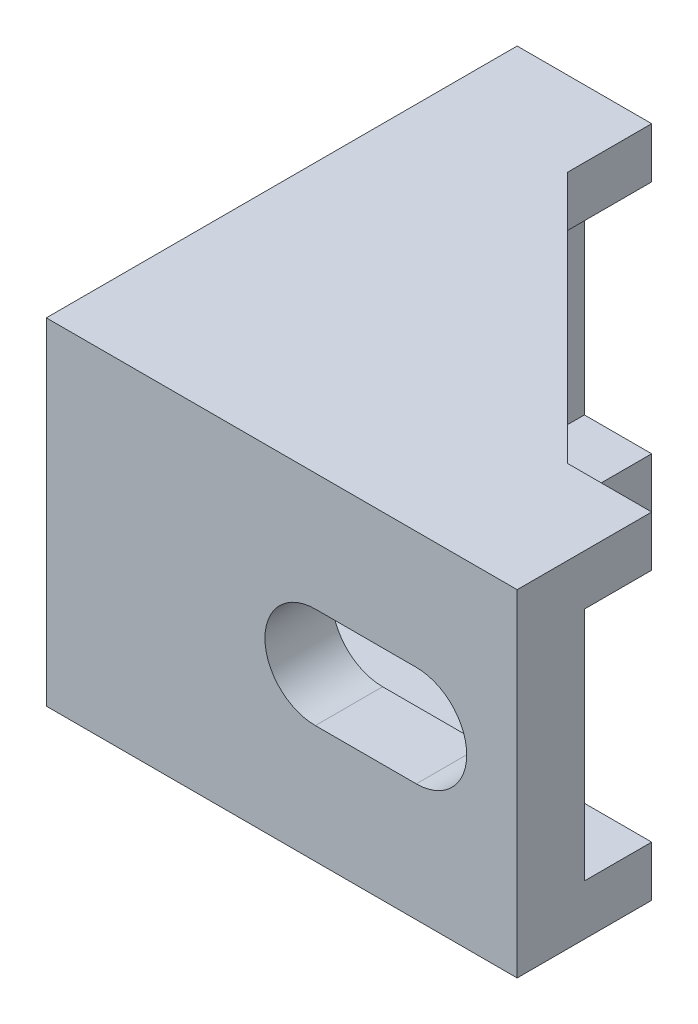
ISO-10303-21;
HEADER;
FILE_DESCRIPTION(('STEP AP214'),'2;1');
FILE_NAME('part.step','',(''),(''),'','','');
FILE_SCHEMA(('AUTOMOTIVE_DESIGN { 1 0 10303 214 1 1 1 1 }'));
ENDSEC;
DATA;
#1=APPLICATION_CONTEXT('core data for automotive mechanical design processes');
#2=APPLICATION_PROTOCOL_DEFINITION('international standard','automotive_design',2000,#1);
#3=PRODUCT_CONTEXT('',#1,'mechanical');
#4=PRODUCT('Part','Part','',(#3));
#5=PRODUCT_RELATED_PRODUCT_CATEGORY('part','',(#4));
#6=PRODUCT_DEFINITION_FORMATION('','',#4);
#7=PRODUCT_DEFINITION_CONTEXT('part definition',#1,'design');
#8=PRODUCT_DEFINITION('design','',#6,#7);
#9=PRODUCT_DEFINITION_SHAPE('','',#8);
#10=(LENGTH_UNIT() NAMED_UNIT(*) SI_UNIT(.MILLI.,.METRE.));
#11=(NAMED_UNIT(*) PLANE_ANGLE_UNIT() SI_UNIT($,.RADIAN.));
#12=(NAMED_UNIT(*) SI_UNIT($,.STERADIAN.) SOLID_ANGLE_UNIT());
#13=UNCERTAINTY_MEASURE_WITH_UNIT(LENGTH_MEASURE(1.E-05),#10,'distance_accuracy_value','');
#14=(GEOMETRIC_REPRESENTATION_CONTEXT(3) GLOBAL_UNCERTAINTY_ASSIGNED_CONTEXT((#13)) GLOBAL_UNIT_ASSIGNED_CONTEXT((#10,
#11,#12)) REPRESENTATION_CONTEXT('',''));
#15=CARTESIAN_POINT('',(0.,0.,0.));
#16=DIRECTION('',(0.,0.,1.));
#17=DIRECTION('',(1.,0.,0.));
#18=AXIS2_PLACEMENT_3D('',#15,#16,#17);
#19=CARTESIAN_POINT('',(0.,-20.,-4.));
#20=DIRECTION('',(0.,0.,1.));
#21=DIRECTION('',(1.,0.,0.));
#22=AXIS2_PLACEMENT_3D('',#19,#20,#21);
#23=PLANE('',#22);
#24=DIRECTION('',(1.,0.,0.));
#25=VECTOR('',#24,1.);
#26=CARTESIAN_POINT('',(0.,-17.,-4.));
#27=LINE('',#26,#25);
#28=CARTESIAN_POINT('',(4.,-17.,-4.));
#29=VERTEX_POINT('',#28);
#30=CARTESIAN_POINT('',(28.,-17.,-4.));
#31=VERTEX_POINT('',#30);
#32=EDGE_CURVE('E282',#29,#31,#27,.T.);
#33=ORIENTED_EDGE('',*,*,#32,.F.);
#34=DIRECTION('',(0.,1.,0.));
#35=VECTOR('',#34,1.);
#36=CARTESIAN_POINT('',(4.,-20.,-4.));
#37=LINE('',#36,#35);
#38=CARTESIAN_POINT('',(4.,-3.,-4.));
#39=VERTEX_POINT('',#38);
#40=EDGE_CURVE('E349',#29,#39,#37,.T.);
#41=ORIENTED_EDGE('',*,*,#40,.T.);
#42=DIRECTION('',(-1.,0.,0.));
#43=VECTOR('',#42,1.);
#44=CARTESIAN_POINT('',(0.,-3.,-4.));
#45=LINE('',#44,#43);
#46=CARTESIAN_POINT('',(28.,-3.,-4.));
#47=VERTEX_POINT('',#46);
#48=EDGE_CURVE('E319',#47,#39,#45,.T.);
#49=ORIENTED_EDGE('',*,*,#48,.F.);
#50=DIRECTION('',(0.,1.,0.));
#51=VECTOR('',#50,1.);
#52=CARTESIAN_POINT('',(28.,-20.,-4.));
#53=LINE('',#52,#51);
#54=EDGE_CURVE('E350',#31,#47,#53,.T.);
#55=ORIENTED_EDGE('',*,*,#54,.F.);
#56=EDGE_LOOP('',(#33,#41,#49,#55));
#57=FACE_BOUND('',#56,.T.);
#58=CARTESIAN_POINT('',(22.,-10.,-3.99999999999999));
#59=DIRECTION('',(0.,0.,1.));
#60=DIRECTION('',(1.,0.,0.));
#61=AXIS2_PLACEMENT_3D('',#58,#59,#60);
#62=CIRCLE('',#61,3.);
#63=CARTESIAN_POINT('',(22.,-13.,-4.));
#64=VERTEX_POINT('',#63);
#65=CARTESIAN_POINT('',(22.,-7.,-3.99999999999999));
#66=VERTEX_POINT('',#65);
#67=EDGE_CURVE('E51',#64,#66,#62,.T.);
#68=ORIENTED_EDGE('',*,*,#67,.T.);
#69=DIRECTION('',(-1.,0.,0.));
#70=VECTOR('',#69,1.);
#71=CARTESIAN_POINT('',(22.,-7.,-3.99999999999999));
#72=LINE('',#71,#70);
#73=CARTESIAN_POINT('',(16.,-7.,-3.99999999999999));
#74=VERTEX_POINT('',#73);
#75=EDGE_CURVE('E199',#66,#74,#72,.T.);
#76=ORIENTED_EDGE('',*,*,#75,.T.);
#77=CARTESIAN_POINT('',(16.,-10.,-3.99999999999999));
#78=DIRECTION('',(0.,0.,1.));
#79=DIRECTION('',(1.,0.,0.));
#80=AXIS2_PLACEMENT_3D('',#77,#78,#79);
#81=CIRCLE('',#80,3.);
#82=CARTESIAN_POINT('',(16.,-13.,-3.99999999999999));
#83=VERTEX_POINT('',#82);
#84=EDGE_CURVE('E202',#74,#83,#81,.T.);
#85=ORIENTED_EDGE('',*,*,#84,.T.);
#86=DIRECTION('',(1.,0.,0.));
#87=VECTOR('',#86,1.);
#88=CARTESIAN_POINT('',(22.,-13.,-3.99999999999999));
#89=LINE('',#88,#87);
#90=EDGE_CURVE('E208',#83,#64,#89,.T.);
#91=ORIENTED_EDGE('',*,*,#90,.T.);
#92=EDGE_LOOP('',(#68,#76,#85,#91));
#93=FACE_BOUND('',#92,.T.);
#94=ADVANCED_FACE('F34',(#57,#93),#23,.F.);
#95=CARTESIAN_POINT('',(0.,-20.,0.));
#96=DIRECTION('',(0.,0.,1.));
#97=DIRECTION('',(1.,0.,0.));
#98=AXIS2_PLACEMENT_3D('',#95,#96,#97);
#99=PLANE('',#98);
#100=DIRECTION('',(0.,1.,0.));
#101=VECTOR('',#100,1.);
#102=CARTESIAN_POINT('',(28.,-20.,0.));
#103=LINE('',#102,#101);
#104=CARTESIAN_POINT('',(28.,-20.,0.));
#105=VERTEX_POINT('',#104);
#106=CARTESIAN_POINT('',(28.,0.,0.));
#107=VERTEX_POINT('',#106);
#108=EDGE_CURVE('E38',#105,#107,#103,.T.);
#109=ORIENTED_EDGE('',*,*,#108,.T.);
#110=DIRECTION('',(1.,0.,0.));
#111=VECTOR('',#110,1.);
#112=CARTESIAN_POINT('',(0.,0.,0.));
#113=LINE('',#112,#111);
#114=CARTESIAN_POINT('',(0.,0.,0.));
#115=VERTEX_POINT('',#114);
#116=EDGE_CURVE('E325',#115,#107,#113,.T.);
#117=ORIENTED_EDGE('',*,*,#116,.F.);
#118=DIRECTION('',(0.,1.,0.));
#119=VECTOR('',#118,1.);
#120=CARTESIAN_POINT('',(0.,-20.,0.));
#121=LINE('',#120,#119);
#122=CARTESIAN_POINT('',(0.,-20.,0.));
#123=VERTEX_POINT('',#122);
#124=EDGE_CURVE('E11',#123,#115,#121,.T.);
#125=ORIENTED_EDGE('',*,*,#124,.F.);
#126=DIRECTION('',(1.,0.,0.));
#127=VECTOR('',#126,1.);
#128=CARTESIAN_POINT('',(0.,-20.,0.));
#129=LINE('',#128,#127);
#130=EDGE_CURVE('E326',#123,#105,#129,.T.);
#131=ORIENTED_EDGE('',*,*,#130,.T.);
#132=EDGE_LOOP('',(#109,#117,#125,#131));
#133=FACE_BOUND('',#132,.T.);
#134=DIRECTION('',(-1.,0.,0.));
#135=VECTOR('',#134,1.);
#136=CARTESIAN_POINT('',(22.,-7.,0.));
#137=LINE('',#136,#135);
#138=CARTESIAN_POINT('',(22.,-7.,0.));
#139=VERTEX_POINT('',#138);
#140=CARTESIAN_POINT('',(16.,-7.,0.));
#141=VERTEX_POINT('',#140);
#142=EDGE_CURVE('E196',#139,#141,#137,.T.);
#143=ORIENTED_EDGE('',*,*,#142,.F.);
#144=CARTESIAN_POINT('',(22.,-10.,0.));
#145=DIRECTION('',(0.,0.,1.));
#146=DIRECTION('',(1.,0.,0.));
#147=AXIS2_PLACEMENT_3D('',#144,#145,#146);
#148=CIRCLE('',#147,3.);
#149=CARTESIAN_POINT('',(22.,-13.,0.));
#150=VERTEX_POINT('',#149);
#151=EDGE_CURVE('E192',#150,#139,#148,.T.);
#152=ORIENTED_EDGE('',*,*,#151,.F.);
#153=DIRECTION('',(1.,0.,0.));
#154=VECTOR('',#153,1.);
#155=CARTESIAN_POINT('',(22.,-13.,0.));
#156=LINE('',#155,#154);
#157=CARTESIAN_POINT('',(16.,-13.,0.));
#158=VERTEX_POINT('',#157);
#159=EDGE_CURVE('E184',#158,#150,#156,.T.);
#160=ORIENTED_EDGE('',*,*,#159,.F.);
#161=CARTESIAN_POINT('',(16.,-10.,0.));
#162=DIRECTION('',(0.,0.,1.));
#163=DIRECTION('',(1.,0.,0.));
#164=AXIS2_PLACEMENT_3D('',#161,#162,#163);
#165=CIRCLE('',#164,3.);
#166=EDGE_CURVE('E191',#141,#158,#165,.T.);
#167=ORIENTED_EDGE('',*,*,#166,.F.);
#168=EDGE_LOOP('',(#143,#152,#160,#167));
#169=FACE_BOUND('',#168,.T.);
#170=ADVANCED_FACE('F36',(#133,#169),#99,.T.);
#171=CARTESIAN_POINT('',(4.,-20.,-28.));
#172=DIRECTION('',(-1.,0.,0.));
#173=DIRECTION('',(0.,0.,1.));
#174=AXIS2_PLACEMENT_3D('',#171,#172,#173);
#175=PLANE('',#174);
#176=DIRECTION('',(0.,0.,1.));
#177=VECTOR('',#176,1.);
#178=CARTESIAN_POINT('',(4.,-7.,-22.));
#179=LINE('',#178,#177);
#180=CARTESIAN_POINT('',(4.,-7.,-22.));
#181=VERTEX_POINT('',#180);
#182=CARTESIAN_POINT('',(4.,-7.,-16.));
#183=VERTEX_POINT('',#182);
#184=EDGE_CURVE('E233',#181,#183,#179,.T.);
#185=ORIENTED_EDGE('',*,*,#184,.F.);
#186=CARTESIAN_POINT('',(4.,-10.,-22.));
#187=DIRECTION('',(1.,0.,0.));
#188=DIRECTION('',(0.,0.,-1.));
#189=AXIS2_PLACEMENT_3D('',#186,#187,#188);
#190=CIRCLE('',#189,3.);
#191=CARTESIAN_POINT('',(4.,-13.,-22.));
#192=VERTEX_POINT('',#191);
#193=EDGE_CURVE('E214',#192,#181,#190,.T.);
#194=ORIENTED_EDGE('',*,*,#193,.F.);
#195=DIRECTION('',(0.,0.,-1.));
#196=VECTOR('',#195,1.);
#197=CARTESIAN_POINT('',(4.,-13.,-22.));
#198=LINE('',#197,#196);
#199=CARTESIAN_POINT('',(4.,-13.,-16.));
#200=VERTEX_POINT('',#199);
#201=EDGE_CURVE('E222',#200,#192,#198,.T.);
#202=ORIENTED_EDGE('',*,*,#201,.F.);
#203=CARTESIAN_POINT('',(4.,-10.,-16.));
#204=DIRECTION('',(1.,0.,0.));
#205=DIRECTION('',(0.,0.,-1.));
#206=AXIS2_PLACEMENT_3D('',#203,#204,#205);
#207=CIRCLE('',#206,3.);
#208=EDGE_CURVE('E236',#183,#200,#207,.T.);
#209=ORIENTED_EDGE('',*,*,#208,.F.);
#210=EDGE_LOOP('',(#185,#194,#202,#209));
#211=FACE_BOUND('',#210,.T.);
#212=DIRECTION('',(0.,0.,1.));
#213=VECTOR('',#212,1.);
#214=CARTESIAN_POINT('',(4.,-17.,-28.));
#215=LINE('',#214,#213);
#216=CARTESIAN_POINT('',(4.,-17.,-28.));
#217=VERTEX_POINT('',#216);
#218=EDGE_CURVE('E284',#217,#29,#215,.T.);
#219=ORIENTED_EDGE('',*,*,#218,.F.);
#220=DIRECTION('',(0.,1.,0.));
#221=VECTOR('',#220,1.);
#222=CARTESIAN_POINT('',(4.,-20.,-28.));
#223=LINE('',#222,#221);
#224=CARTESIAN_POINT('',(4.,-3.,-28.));
#225=VERTEX_POINT('',#224);
#226=EDGE_CURVE('E347',#217,#225,#223,.T.);
#227=ORIENTED_EDGE('',*,*,#226,.T.);
#228=DIRECTION('',(0.,0.,-1.));
#229=VECTOR('',#228,1.);
#230=CARTESIAN_POINT('',(4.,-3.,-28.));
#231=LINE('',#230,#229);
#232=EDGE_CURVE('E322',#39,#225,#231,.T.);
#233=ORIENTED_EDGE('',*,*,#232,.F.);
#234=ORIENTED_EDGE('',*,*,#40,.F.);
#235=EDGE_LOOP('',(#219,#227,#233,#234));
#236=FACE_BOUND('',#235,.T.);
#237=ADVANCED_FACE('F395',(#211,#236),#175,.F.);
#238=CARTESIAN_POINT('',(0.,-20.,-28.));
#239=DIRECTION('',(-1.,0.,0.));
#240=DIRECTION('',(0.,0.,1.));
#241=AXIS2_PLACEMENT_3D('',#238,#239,#240);
#242=PLANE('',#241);
#243=CARTESIAN_POINT('',(0.,-10.,-22.));
#244=DIRECTION('',(1.,0.,0.));
#245=DIRECTION('',(0.,0.,-1.));
#246=AXIS2_PLACEMENT_3D('',#243,#244,#245);
#247=CIRCLE('',#246,3.);
#248=CARTESIAN_POINT('',(0.,-13.,-22.));
#249=VERTEX_POINT('',#248);
#250=CARTESIAN_POINT('',(0.,-7.,-22.));
#251=VERTEX_POINT('',#250);
#252=EDGE_CURVE('E218',#249,#251,#247,.T.);
#253=ORIENTED_EDGE('',*,*,#252,.T.);
#254=DIRECTION('',(0.,0.,1.));
#255=VECTOR('',#254,1.);
#256=CARTESIAN_POINT('',(0.,-7.,-22.));
#257=LINE('',#256,#255);
#258=CARTESIAN_POINT('',(0.,-7.,-16.));
#259=VERTEX_POINT('',#258);
#260=EDGE_CURVE('E221',#251,#259,#257,.T.);
#261=ORIENTED_EDGE('',*,*,#260,.T.);
#262=CARTESIAN_POINT('',(0.,-10.,-16.));
#263=DIRECTION('',(1.,0.,0.));
#264=DIRECTION('',(0.,0.,-1.));
#265=AXIS2_PLACEMENT_3D('',#262,#263,#264);
#266=CIRCLE('',#265,3.);
#267=CARTESIAN_POINT('',(0.,-13.,-16.));
#268=VERTEX_POINT('',#267);
#269=EDGE_CURVE('E225',#259,#268,#266,.T.);
#270=ORIENTED_EDGE('',*,*,#269,.T.);
#271=DIRECTION('',(0.,0.,-1.));
#272=VECTOR('',#271,1.);
#273=CARTESIAN_POINT('',(0.,-13.,-22.));
#274=LINE('',#273,#272);
#275=EDGE_CURVE('E228',#268,#249,#274,.T.);
#276=ORIENTED_EDGE('',*,*,#275,.T.);
#277=EDGE_LOOP('',(#253,#261,#270,#276));
#278=FACE_BOUND('',#277,.T.);
#279=ORIENTED_EDGE('',*,*,#124,.T.);
#280=DIRECTION('',(0.,0.,1.));
#281=VECTOR('',#280,1.);
#282=CARTESIAN_POINT('',(0.,0.,-28.));
#283=LINE('',#282,#281);
#284=CARTESIAN_POINT('',(0.,0.,-28.));
#285=VERTEX_POINT('',#284);
#286=EDGE_CURVE('E330',#285,#115,#283,.T.);
#287=ORIENTED_EDGE('',*,*,#286,.F.);
#288=DIRECTION('',(0.,1.,0.));
#289=VECTOR('',#288,1.);
#290=CARTESIAN_POINT('',(0.,-20.,-28.));
#291=LINE('',#290,#289);
#292=CARTESIAN_POINT('',(0.,-20.,-28.));
#293=VERTEX_POINT('',#292);
#294=EDGE_CURVE('E43',#293,#285,#291,.T.);
#295=ORIENTED_EDGE('',*,*,#294,.F.);
#296=DIRECTION('',(0.,0.,1.));
#297=VECTOR('',#296,1.);
#298=CARTESIAN_POINT('',(0.,-20.,-28.));
#299=LINE('',#298,#297);
#300=EDGE_CURVE('E334',#293,#123,#299,.T.);
#301=ORIENTED_EDGE('',*,*,#300,.T.);
#302=EDGE_LOOP('',(#279,#287,#295,#301));
#303=FACE_BOUND('',#302,.T.);
#304=ADVANCED_FACE('F367',(#278,#303),#242,.T.);
#305=CARTESIAN_POINT('',(0.,-20.,-28.));
#306=DIRECTION('',(0.,0.,1.));
#307=DIRECTION('',(1.,0.,0.));
#308=AXIS2_PLACEMENT_3D('',#305,#306,#307);
#309=PLANE('',#308);
#310=ORIENTED_EDGE('',*,*,#294,.T.);
#311=DIRECTION('',(1.,0.,0.));
#312=VECTOR('',#311,1.);
#313=CARTESIAN_POINT('',(0.,0.,-28.));
#314=LINE('',#313,#312);
#315=CARTESIAN_POINT('',(8.,0.,-28.));
#316=VERTEX_POINT('',#315);
#317=EDGE_CURVE('E342',#285,#316,#314,.T.);
#318=ORIENTED_EDGE('',*,*,#317,.T.);
#319=DIRECTION('',(0.,1.,0.));
#320=VECTOR('',#319,1.);
#321=CARTESIAN_POINT('',(8.,0.,-28.));
#322=LINE('',#321,#320);
#323=CARTESIAN_POINT('',(8.,-3.,-28.));
#324=VERTEX_POINT('',#323);
#325=EDGE_CURVE('E297',#324,#316,#322,.T.);
#326=ORIENTED_EDGE('',*,*,#325,.F.);
#327=DIRECTION('',(1.,0.,0.));
#328=VECTOR('',#327,1.);
#329=CARTESIAN_POINT('',(14.,-3.,-28.));
#330=LINE('',#329,#328);
#331=EDGE_CURVE('E291',#225,#324,#330,.T.);
#332=ORIENTED_EDGE('',*,*,#331,.F.);
#333=ORIENTED_EDGE('',*,*,#226,.F.);
#334=DIRECTION('',(1.,0.,0.));
#335=VECTOR('',#334,1.);
#336=CARTESIAN_POINT('',(14.,-17.,-28.));
#337=LINE('',#336,#335);
#338=CARTESIAN_POINT('',(8.,-17.,-28.));
#339=VERTEX_POINT('',#338);
#340=EDGE_CURVE('E254',#217,#339,#337,.T.);
#341=ORIENTED_EDGE('',*,*,#340,.T.);
#342=DIRECTION('',(0.,-1.,0.));
#343=VECTOR('',#342,1.);
#344=CARTESIAN_POINT('',(8.,-20.,-28.));
#345=LINE('',#344,#343);
#346=CARTESIAN_POINT('',(8.,-20.,-28.));
#347=VERTEX_POINT('',#346);
#348=EDGE_CURVE('E279',#339,#347,#345,.T.);
#349=ORIENTED_EDGE('',*,*,#348,.T.);
#350=DIRECTION('',(1.,0.,0.));
#351=VECTOR('',#350,1.);
#352=CARTESIAN_POINT('',(0.,-20.,-28.));
#353=LINE('',#352,#351);
#354=EDGE_CURVE('E332',#293,#347,#353,.T.);
#355=ORIENTED_EDGE('',*,*,#354,.F.);
#356=EDGE_LOOP('',(#310,#318,#326,#332,#333,#341,#349,#355));
#357=FACE_BOUND('',#356,.T.);
#358=ADVANCED_FACE('F389',(#357),#309,.F.);
#359=CARTESIAN_POINT('',(28.,-20.,-4.));
#360=DIRECTION('',(-1.,0.,0.));
#361=DIRECTION('',(0.,0.,1.));
#362=AXIS2_PLACEMENT_3D('',#359,#360,#361);
#363=PLANE('',#362);
#364=DIRECTION('',(0.,0.,1.));
#365=VECTOR('',#364,1.);
#366=CARTESIAN_POINT('',(28.,-20.,-4.));
#367=LINE('',#366,#365);
#368=CARTESIAN_POINT('',(28.,-20.,-8.));
#369=VERTEX_POINT('',#368);
#370=EDGE_CURVE('E329',#369,#105,#367,.T.);
#371=ORIENTED_EDGE('',*,*,#370,.F.);
#372=DIRECTION('',(0.,-1.,0.));
#373=VECTOR('',#372,1.);
#374=CARTESIAN_POINT('',(28.,-20.,-8.));
#375=LINE('',#374,#373);
#376=CARTESIAN_POINT('',(28.,-17.,-8.));
#377=VERTEX_POINT('',#376);
#378=EDGE_CURVE('E260',#377,#369,#375,.T.);
#379=ORIENTED_EDGE('',*,*,#378,.F.);
#380=DIRECTION('',(0.,0.,-1.));
#381=VECTOR('',#380,1.);
#382=CARTESIAN_POINT('',(28.,-17.,-14.));
#383=LINE('',#382,#381);
#384=EDGE_CURVE('E243',#377,#31,#383,.F.);
#385=ORIENTED_EDGE('',*,*,#384,.T.);
#386=ORIENTED_EDGE('',*,*,#54,.T.);
#387=DIRECTION('',(0.,0.,1.));
#388=VECTOR('',#387,1.);
#389=CARTESIAN_POINT('',(28.,-3.,-14.));
#390=LINE('',#389,#388);
#391=CARTESIAN_POINT('',(28.,-3.,-8.));
#392=VERTEX_POINT('',#391);
#393=EDGE_CURVE('E286',#392,#47,#390,.T.);
#394=ORIENTED_EDGE('',*,*,#393,.F.);
#395=DIRECTION('',(0.,1.,0.));
#396=VECTOR('',#395,1.);
#397=CARTESIAN_POINT('',(28.,0.,-8.));
#398=LINE('',#397,#396);
#399=CARTESIAN_POINT('',(28.,0.,-8.));
#400=VERTEX_POINT('',#399);
#401=EDGE_CURVE('E316',#392,#400,#398,.T.);
#402=ORIENTED_EDGE('',*,*,#401,.T.);
#403=DIRECTION('',(0.,0.,1.));
#404=VECTOR('',#403,1.);
#405=CARTESIAN_POINT('',(28.,0.,-4.));
#406=LINE('',#405,#404);
#407=EDGE_CURVE('E339',#400,#107,#406,.T.);
#408=ORIENTED_EDGE('',*,*,#407,.T.);
#409=ORIENTED_EDGE('',*,*,#108,.F.);
#410=EDGE_LOOP('',(#371,#379,#385,#386,#394,#402,#408,#409));
#411=FACE_BOUND('',#410,.T.);
#412=ADVANCED_FACE('F359',(#411),#363,.F.);
#413=CARTESIAN_POINT('',(0.,-20.,0.));
#414=DIRECTION('',(0.,-1.,0.));
#415=DIRECTION('',(-1.,0.,0.));
#416=AXIS2_PLACEMENT_3D('',#413,#414,#415);
#417=PLANE('',#416);
#418=ORIENTED_EDGE('',*,*,#130,.F.);
#419=ORIENTED_EDGE('',*,*,#300,.F.);
#420=ORIENTED_EDGE('',*,*,#354,.T.);
#421=DIRECTION('',(0.,0.,1.));
#422=VECTOR('',#421,1.);
#423=CARTESIAN_POINT('',(8.,-20.,-28.));
#424=LINE('',#423,#422);
#425=CARTESIAN_POINT('',(8.,-20.,-23.));
#426=VERTEX_POINT('',#425);
#427=EDGE_CURVE('E257',#347,#426,#424,.T.);
#428=ORIENTED_EDGE('',*,*,#427,.T.);
#429=DIRECTION('',(0.707106781186547,0.,0.707106781186548));
#430=VECTOR('',#429,1.);
#431=CARTESIAN_POINT('',(8.,-20.,-23.));
#432=LINE('',#431,#430);
#433=CARTESIAN_POINT('',(23.,-20.,-8.));
#434=VERTEX_POINT('',#433);
#435=EDGE_CURVE('E253',#426,#434,#432,.T.);
#436=ORIENTED_EDGE('',*,*,#435,.T.);
#437=DIRECTION('',(1.,0.,0.));
#438=VECTOR('',#437,1.);
#439=CARTESIAN_POINT('',(23.,-20.,-8.));
#440=LINE('',#439,#438);
#441=EDGE_CURVE('E250',#434,#369,#440,.T.);
#442=ORIENTED_EDGE('',*,*,#441,.T.);
#443=ORIENTED_EDGE('',*,*,#370,.T.);
#444=EDGE_LOOP('',(#418,#419,#420,#428,#436,#442,#443));
#445=FACE_BOUND('',#444,.T.);
#446=ADVANCED_FACE('F371',(#445),#417,.T.);
#447=CARTESIAN_POINT('',(0.,0.,0.));
#448=DIRECTION('',(0.,-1.,0.));
#449=DIRECTION('',(-1.,0.,0.));
#450=AXIS2_PLACEMENT_3D('',#447,#448,#449);
#451=PLANE('',#450);
#452=ORIENTED_EDGE('',*,*,#407,.F.);
#453=DIRECTION('',(1.,0.,0.));
#454=VECTOR('',#453,1.);
#455=CARTESIAN_POINT('',(23.,0.,-8.));
#456=LINE('',#455,#454);
#457=CARTESIAN_POINT('',(23.,0.,-8.));
#458=VERTEX_POINT('',#457);
#459=EDGE_CURVE('E287',#458,#400,#456,.T.);
#460=ORIENTED_EDGE('',*,*,#459,.F.);
#461=DIRECTION('',(0.707106781186547,0.,0.707106781186548));
#462=VECTOR('',#461,1.);
#463=CARTESIAN_POINT('',(8.,0.,-23.));
#464=LINE('',#463,#462);
#465=CARTESIAN_POINT('',(8.,0.,-23.));
#466=VERTEX_POINT('',#465);
#467=EDGE_CURVE('E290',#466,#458,#464,.T.);
#468=ORIENTED_EDGE('',*,*,#467,.F.);
#469=DIRECTION('',(0.,0.,1.));
#470=VECTOR('',#469,1.);
#471=CARTESIAN_POINT('',(8.,0.,-28.));
#472=LINE('',#471,#470);
#473=EDGE_CURVE('E294',#316,#466,#472,.T.);
#474=ORIENTED_EDGE('',*,*,#473,.F.);
#475=ORIENTED_EDGE('',*,*,#317,.F.);
#476=ORIENTED_EDGE('',*,*,#286,.T.);
#477=ORIENTED_EDGE('',*,*,#116,.T.);
#478=EDGE_LOOP('',(#452,#460,#468,#474,#475,#476,#477));
#479=FACE_BOUND('',#478,.T.);
#480=ADVANCED_FACE('F362',(#479),#451,.F.);
#481=CARTESIAN_POINT('',(14.,-3.,-14.));
#482=DIRECTION('',(0.,1.,0.));
#483=DIRECTION('',(0.,0.,1.));
#484=AXIS2_PLACEMENT_3D('',#481,#482,#483);
#485=PLANE('',#484);
#486=ORIENTED_EDGE('',*,*,#48,.T.);
#487=ORIENTED_EDGE('',*,*,#232,.T.);
#488=ORIENTED_EDGE('',*,*,#331,.T.);
#489=DIRECTION('',(0.,0.,1.));
#490=VECTOR('',#489,1.);
#491=CARTESIAN_POINT('',(8.,-3.,-14.));
#492=LINE('',#491,#490);
#493=CARTESIAN_POINT('',(8.,-3.,-23.));
#494=VERTEX_POINT('',#493);
#495=EDGE_CURVE('E299',#324,#494,#492,.T.);
#496=ORIENTED_EDGE('',*,*,#495,.T.);
#497=DIRECTION('',(0.707106781186547,0.,0.707106781186548));
#498=VECTOR('',#497,1.);
#499=CARTESIAN_POINT('',(8.,-3.,-23.));
#500=LINE('',#499,#498);
#501=CARTESIAN_POINT('',(23.,-3.,-8.));
#502=VERTEX_POINT('',#501);
#503=EDGE_CURVE('E302',#494,#502,#500,.T.);
#504=ORIENTED_EDGE('',*,*,#503,.T.);
#505=DIRECTION('',(1.,0.,0.));
#506=VECTOR('',#505,1.);
#507=CARTESIAN_POINT('',(14.,-3.,-8.));
#508=LINE('',#507,#506);
#509=EDGE_CURVE('E305',#502,#392,#508,.T.);
#510=ORIENTED_EDGE('',*,*,#509,.T.);
#511=ORIENTED_EDGE('',*,*,#393,.T.);
#512=EDGE_LOOP('',(#486,#487,#488,#496,#504,#510,#511));
#513=FACE_BOUND('',#512,.T.);
#514=ADVANCED_FACE('F401',(#513),#485,.F.);
#515=CARTESIAN_POINT('',(23.,0.,-8.));
#516=DIRECTION('',(0.,0.,1.));
#517=DIRECTION('',(1.,0.,0.));
#518=AXIS2_PLACEMENT_3D('',#515,#516,#517);
#519=PLANE('',#518);
#520=ORIENTED_EDGE('',*,*,#401,.F.);
#521=ORIENTED_EDGE('',*,*,#509,.F.);
#522=DIRECTION('',(0.,1.,0.));
#523=VECTOR('',#522,1.);
#524=CARTESIAN_POINT('',(23.,0.,-8.));
#525=LINE('',#524,#523);
#526=EDGE_CURVE('E314',#502,#458,#525,.T.);
#527=ORIENTED_EDGE('',*,*,#526,.T.);
#528=ORIENTED_EDGE('',*,*,#459,.T.);
#529=EDGE_LOOP('',(#520,#521,#527,#528));
#530=FACE_BOUND('',#529,.T.);
#531=ADVANCED_FACE('F451',(#530),#519,.F.);
#532=CARTESIAN_POINT('',(8.,0.,-23.));
#533=DIRECTION('',(-0.707106781186548,0.,0.707106781186547));
#534=DIRECTION('',(0.707106781186547,0.,0.707106781186548));
#535=AXIS2_PLACEMENT_3D('',#532,#533,#534);
#536=PLANE('',#535);
#537=ORIENTED_EDGE('',*,*,#526,.F.);
#538=ORIENTED_EDGE('',*,*,#503,.F.);
#539=DIRECTION('',(0.,1.,0.));
#540=VECTOR('',#539,1.);
#541=CARTESIAN_POINT('',(8.,0.,-23.));
#542=LINE('',#541,#540);
#543=EDGE_CURVE('E312',#494,#466,#542,.T.);
#544=ORIENTED_EDGE('',*,*,#543,.T.);
#545=ORIENTED_EDGE('',*,*,#467,.T.);
#546=EDGE_LOOP('',(#537,#538,#544,#545));
#547=FACE_BOUND('',#546,.T.);
#548=ADVANCED_FACE('F454',(#547),#536,.F.);
#549=CARTESIAN_POINT('',(8.,0.,-28.));
#550=DIRECTION('',(-1.,0.,0.));
#551=DIRECTION('',(0.,0.,1.));
#552=AXIS2_PLACEMENT_3D('',#549,#550,#551);
#553=PLANE('',#552);
#554=ORIENTED_EDGE('',*,*,#543,.F.);
#555=ORIENTED_EDGE('',*,*,#495,.F.);
#556=ORIENTED_EDGE('',*,*,#325,.T.);
#557=ORIENTED_EDGE('',*,*,#473,.T.);
#558=EDGE_LOOP('',(#554,#555,#556,#557));
#559=FACE_BOUND('',#558,.T.);
#560=ADVANCED_FACE('F442',(#559),#553,.F.);
#561=CARTESIAN_POINT('',(14.,-17.,-14.));
#562=DIRECTION('',(0.,-1.,0.));
#563=DIRECTION('',(0.,0.,-1.));
#564=AXIS2_PLACEMENT_3D('',#561,#562,#563);
#565=PLANE('',#564);
#566=ORIENTED_EDGE('',*,*,#340,.F.);
#567=ORIENTED_EDGE('',*,*,#218,.T.);
#568=ORIENTED_EDGE('',*,*,#32,.T.);
#569=ORIENTED_EDGE('',*,*,#384,.F.);
#570=DIRECTION('',(1.,0.,0.));
#571=VECTOR('',#570,1.);
#572=CARTESIAN_POINT('',(14.,-17.,-8.));
#573=LINE('',#572,#571);
#574=CARTESIAN_POINT('',(23.,-17.,-8.));
#575=VERTEX_POINT('',#574);
#576=EDGE_CURVE('E263',#575,#377,#573,.T.);
#577=ORIENTED_EDGE('',*,*,#576,.F.);
#578=DIRECTION('',(0.707106781186547,0.,0.707106781186548));
#579=VECTOR('',#578,1.);
#580=CARTESIAN_POINT('',(8.,-17.,-23.));
#581=LINE('',#580,#579);
#582=CARTESIAN_POINT('',(8.,-17.,-23.));
#583=VERTEX_POINT('',#582);
#584=EDGE_CURVE('E266',#583,#575,#581,.T.);
#585=ORIENTED_EDGE('',*,*,#584,.F.);
#586=DIRECTION('',(0.,0.,-1.));
#587=VECTOR('',#586,1.);
#588=CARTESIAN_POINT('',(8.,-17.,-14.));
#589=LINE('',#588,#587);
#590=EDGE_CURVE('E269',#339,#583,#589,.F.);
#591=ORIENTED_EDGE('',*,*,#590,.F.);
#592=EDGE_LOOP('',(#566,#567,#568,#569,#577,#585,#591));
#593=FACE_BOUND('',#592,.T.);
#594=ADVANCED_FACE('F379',(#593),#565,.F.);
#595=CARTESIAN_POINT('',(8.,-20.,-28.));
#596=DIRECTION('',(1.,0.,0.));
#597=DIRECTION('',(0.,0.,1.));
#598=AXIS2_PLACEMENT_3D('',#595,#596,#597);
#599=PLANE('',#598);
#600=ORIENTED_EDGE('',*,*,#348,.F.);
#601=ORIENTED_EDGE('',*,*,#590,.T.);
#602=DIRECTION('',(0.,-1.,0.));
#603=VECTOR('',#602,1.);
#604=CARTESIAN_POINT('',(8.,-20.,-23.));
#605=LINE('',#604,#603);
#606=EDGE_CURVE('E277',#583,#426,#605,.T.);
#607=ORIENTED_EDGE('',*,*,#606,.T.);
#608=ORIENTED_EDGE('',*,*,#427,.F.);
#609=EDGE_LOOP('',(#600,#601,#607,#608));
#610=FACE_BOUND('',#609,.T.);
#611=ADVANCED_FACE('F387',(#610),#599,.T.);
#612=CARTESIAN_POINT('',(8.,-20.,-23.));
#613=DIRECTION('',(0.707106781186548,0.,-0.707106781186547));
#614=DIRECTION('',(0.707106781186547,0.,0.707106781186548));
#615=AXIS2_PLACEMENT_3D('',#612,#613,#614);
#616=PLANE('',#615);
#617=ORIENTED_EDGE('',*,*,#606,.F.);
#618=ORIENTED_EDGE('',*,*,#584,.T.);
#619=DIRECTION('',(0.,-1.,0.));
#620=VECTOR('',#619,1.);
#621=CARTESIAN_POINT('',(23.,-20.,-8.));
#622=LINE('',#621,#620);
#623=EDGE_CURVE('E275',#575,#434,#622,.T.);
#624=ORIENTED_EDGE('',*,*,#623,.T.);
#625=ORIENTED_EDGE('',*,*,#435,.F.);
#626=EDGE_LOOP('',(#617,#618,#624,#625));
#627=FACE_BOUND('',#626,.T.);
#628=ADVANCED_FACE('F382',(#627),#616,.T.);
#629=CARTESIAN_POINT('',(23.,-20.,-8.));
#630=DIRECTION('',(0.,0.,-1.));
#631=DIRECTION('',(1.,0.,0.));
#632=AXIS2_PLACEMENT_3D('',#629,#630,#631);
#633=PLANE('',#632);
#634=ORIENTED_EDGE('',*,*,#623,.F.);
#635=ORIENTED_EDGE('',*,*,#576,.T.);
#636=ORIENTED_EDGE('',*,*,#378,.T.);
#637=ORIENTED_EDGE('',*,*,#441,.F.);
#638=EDGE_LOOP('',(#634,#635,#636,#637));
#639=FACE_BOUND('',#638,.T.);
#640=ADVANCED_FACE('F375',(#639),#633,.T.);
#641=CARTESIAN_POINT('',(0.,-10.,-22.));
#642=DIRECTION('',(1.,0.,0.));
#643=DIRECTION('',(0.,0.,-1.));
#644=AXIS2_PLACEMENT_3D('',#641,#642,#643);
#645=CYLINDRICAL_SURFACE('',#644,3.);
#646=ORIENTED_EDGE('',*,*,#193,.T.);
#647=DIRECTION('',(1.,0.,0.));
#648=VECTOR('',#647,1.);
#649=CARTESIAN_POINT('',(0.,-7.,-22.));
#650=LINE('',#649,#648);
#651=EDGE_CURVE('E231',#251,#181,#650,.T.);
#652=ORIENTED_EDGE('',*,*,#651,.F.);
#653=ORIENTED_EDGE('',*,*,#252,.F.);
#654=DIRECTION('',(1.,0.,0.));
#655=VECTOR('',#654,1.);
#656=CARTESIAN_POINT('',(0.,-13.,-22.));
#657=LINE('',#656,#655);
#658=EDGE_CURVE('E241',#249,#192,#657,.T.);
#659=ORIENTED_EDGE('',*,*,#658,.T.);
#660=EDGE_LOOP('',(#646,#652,#653,#659));
#661=FACE_BOUND('',#660,.T.);
#662=ADVANCED_FACE('F429',(#661),#645,.F.);
#663=CARTESIAN_POINT('',(0.,-13.,-22.));
#664=DIRECTION('',(0.,-1.,0.));
#665=DIRECTION('',(0.,0.,-1.));
#666=AXIS2_PLACEMENT_3D('',#663,#664,#665);
#667=PLANE('',#666);
#668=ORIENTED_EDGE('',*,*,#201,.T.);
#669=ORIENTED_EDGE('',*,*,#658,.F.);
#670=ORIENTED_EDGE('',*,*,#275,.F.);
#671=DIRECTION('',(1.,0.,0.));
#672=VECTOR('',#671,1.);
#673=CARTESIAN_POINT('',(0.,-13.,-16.));
#674=LINE('',#673,#672);
#675=EDGE_CURVE('E244',#268,#200,#674,.T.);
#676=ORIENTED_EDGE('',*,*,#675,.T.);
#677=EDGE_LOOP('',(#668,#669,#670,#676));
#678=FACE_BOUND('',#677,.T.);
#679=ADVANCED_FACE('F425',(#678),#667,.F.);
#680=CARTESIAN_POINT('',(0.,-10.,-16.));
#681=DIRECTION('',(1.,0.,0.));
#682=DIRECTION('',(0.,0.,-1.));
#683=AXIS2_PLACEMENT_3D('',#680,#681,#682);
#684=CYLINDRICAL_SURFACE('',#683,3.);
#685=ORIENTED_EDGE('',*,*,#208,.T.);
#686=ORIENTED_EDGE('',*,*,#675,.F.);
#687=ORIENTED_EDGE('',*,*,#269,.F.);
#688=DIRECTION('',(1.,0.,0.));
#689=VECTOR('',#688,1.);
#690=CARTESIAN_POINT('',(0.,-7.,-16.));
#691=LINE('',#690,#689);
#692=EDGE_CURVE('E246',#259,#183,#691,.T.);
#693=ORIENTED_EDGE('',*,*,#692,.T.);
#694=EDGE_LOOP('',(#685,#686,#687,#693));
#695=FACE_BOUND('',#694,.T.);
#696=ADVANCED_FACE('F428',(#695),#684,.F.);
#697=CARTESIAN_POINT('',(0.,-7.,-22.));
#698=DIRECTION('',(0.,1.,0.));
#699=DIRECTION('',(0.,0.,1.));
#700=AXIS2_PLACEMENT_3D('',#697,#698,#699);
#701=PLANE('',#700);
#702=ORIENTED_EDGE('',*,*,#184,.T.);
#703=ORIENTED_EDGE('',*,*,#692,.F.);
#704=ORIENTED_EDGE('',*,*,#260,.F.);
#705=ORIENTED_EDGE('',*,*,#651,.T.);
#706=EDGE_LOOP('',(#702,#703,#704,#705));
#707=FACE_BOUND('',#706,.T.);
#708=ADVANCED_FACE('F420',(#707),#701,.F.);
#709=CARTESIAN_POINT('',(22.,-10.,0.));
#710=DIRECTION('',(0.,0.,-1.));
#711=DIRECTION('',(-1.,0.,0.));
#712=AXIS2_PLACEMENT_3D('',#709,#710,#711);
#713=CYLINDRICAL_SURFACE('',#712,3.);
#714=ORIENTED_EDGE('',*,*,#67,.F.);
#715=DIRECTION('',(0.,0.,-1.));
#716=VECTOR('',#715,1.);
#717=CARTESIAN_POINT('',(22.,-13.,0.));
#718=LINE('',#717,#716);
#719=EDGE_CURVE('E186',#150,#64,#718,.T.);
#720=ORIENTED_EDGE('',*,*,#719,.F.);
#721=ORIENTED_EDGE('',*,*,#151,.T.);
#722=DIRECTION('',(0.,0.,-1.));
#723=VECTOR('',#722,1.);
#724=CARTESIAN_POINT('',(22.,-7.,0.));
#725=LINE('',#724,#723);
#726=EDGE_CURVE('E212',#139,#66,#725,.T.);
#727=ORIENTED_EDGE('',*,*,#726,.T.);
#728=EDGE_LOOP('',(#714,#720,#721,#727));
#729=FACE_BOUND('',#728,.T.);
#730=ADVANCED_FACE('F194',(#729),#713,.F.);
#731=CARTESIAN_POINT('',(22.,-7.,0.));
#732=DIRECTION('',(0.,-1.,0.));
#733=DIRECTION('',(0.,0.,-1.));
#734=AXIS2_PLACEMENT_3D('',#731,#732,#733);
#735=PLANE('',#734);
#736=ORIENTED_EDGE('',*,*,#75,.F.);
#737=ORIENTED_EDGE('',*,*,#726,.F.);
#738=ORIENTED_EDGE('',*,*,#142,.T.);
#739=DIRECTION('',(0.,0.,-1.));
#740=VECTOR('',#739,1.);
#741=CARTESIAN_POINT('',(16.,-7.,0.));
#742=LINE('',#741,#740);
#743=EDGE_CURVE('E215',#141,#74,#742,.T.);
#744=ORIENTED_EDGE('',*,*,#743,.T.);
#745=EDGE_LOOP('',(#736,#737,#738,#744));
#746=FACE_BOUND('',#745,.T.);
#747=ADVANCED_FACE('F412',(#746),#735,.T.);
#748=CARTESIAN_POINT('',(16.,-10.,0.));
#749=DIRECTION('',(0.,0.,-1.));
#750=DIRECTION('',(-1.,0.,0.));
#751=AXIS2_PLACEMENT_3D('',#748,#749,#750);
#752=CYLINDRICAL_SURFACE('',#751,3.);
#753=ORIENTED_EDGE('',*,*,#84,.F.);
#754=ORIENTED_EDGE('',*,*,#743,.F.);
#755=ORIENTED_EDGE('',*,*,#166,.T.);
#756=DIRECTION('',(0.,0.,-1.));
#757=VECTOR('',#756,1.);
#758=CARTESIAN_POINT('',(16.,-13.,0.));
#759=LINE('',#758,#757);
#760=EDGE_CURVE('E59',#158,#83,#759,.T.);
#761=ORIENTED_EDGE('',*,*,#760,.T.);
#762=EDGE_LOOP('',(#753,#754,#755,#761));
#763=FACE_BOUND('',#762,.T.);
#764=ADVANCED_FACE('F410',(#763),#752,.F.);
#765=CARTESIAN_POINT('',(22.,-13.,0.));
#766=DIRECTION('',(0.,1.,0.));
#767=DIRECTION('',(-1.,0.,0.));
#768=AXIS2_PLACEMENT_3D('',#765,#766,#767);
#769=PLANE('',#768);
#770=ORIENTED_EDGE('',*,*,#90,.F.);
#771=ORIENTED_EDGE('',*,*,#760,.F.);
#772=ORIENTED_EDGE('',*,*,#159,.T.);
#773=ORIENTED_EDGE('',*,*,#719,.T.);
#774=EDGE_LOOP('',(#770,#771,#772,#773));
#775=FACE_BOUND('',#774,.T.);
#776=ADVANCED_FACE('F185',(#775),#769,.T.);
#777=CLOSED_SHELL('',(#94,#170,#237,#304,#358,#412,#446,#480,#514,#531,#548,#560,#594,#611,#628,
#640,#662,#679,#696,#708,#730,#747,#764,#776));
#778=MANIFOLD_SOLID_BREP('B2',#777);
#779=ADVANCED_BREP_SHAPE_REPRESENTATION('',(#18,#778),#14);
#780=SHAPE_DEFINITION_REPRESENTATION(#9,#779);
ENDSEC;
END-ISO-10303-21;
